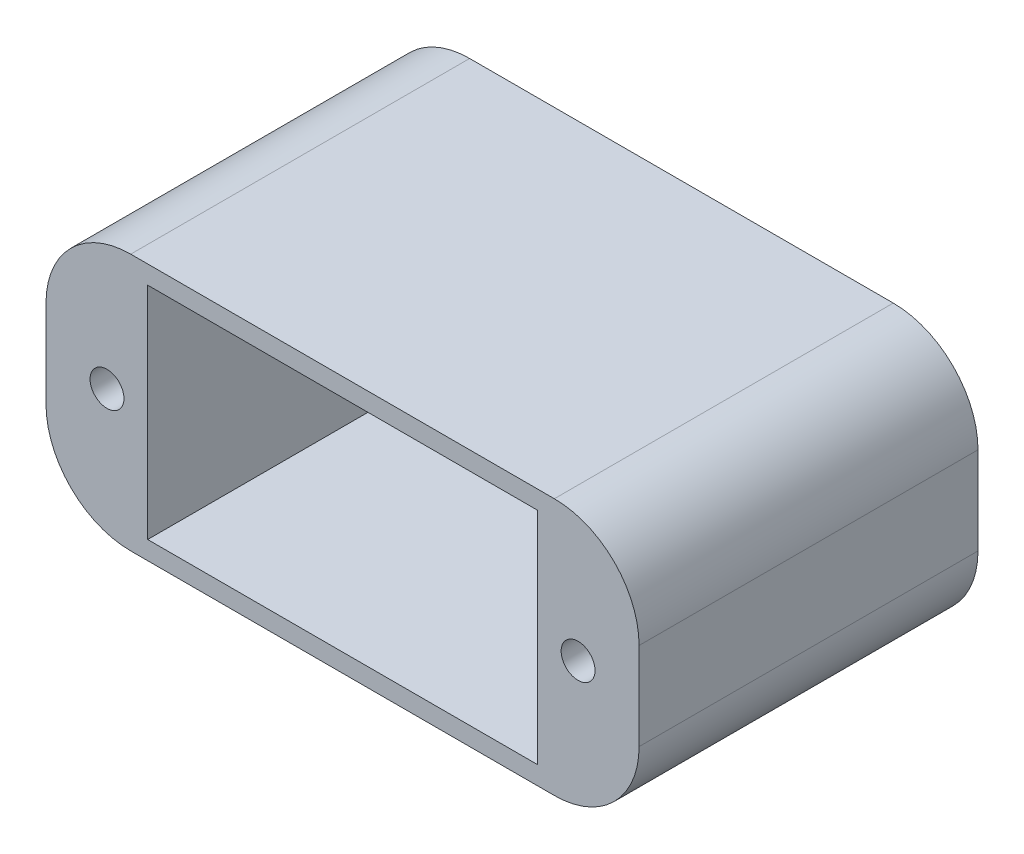
ISO-10303-21;
HEADER;
FILE_DESCRIPTION(('STEP AP214'),'2;1');
FILE_NAME('part.step','',(''),(''),'','','');
FILE_SCHEMA(('AUTOMOTIVE_DESIGN { 1 0 10303 214 1 1 1 1 }'));
ENDSEC;
DATA;
#1=APPLICATION_CONTEXT('core data for automotive mechanical design processes');
#2=APPLICATION_PROTOCOL_DEFINITION('international standard','automotive_design',2000,#1);
#3=PRODUCT_CONTEXT('',#1,'mechanical');
#4=PRODUCT('Part','Part','',(#3));
#5=PRODUCT_RELATED_PRODUCT_CATEGORY('part','',(#4));
#6=PRODUCT_DEFINITION_FORMATION('','',#4);
#7=PRODUCT_DEFINITION_CONTEXT('part definition',#1,'design');
#8=PRODUCT_DEFINITION('design','',#6,#7);
#9=PRODUCT_DEFINITION_SHAPE('','',#8);
#10=(LENGTH_UNIT() NAMED_UNIT(*) SI_UNIT(.MILLI.,.METRE.));
#11=(NAMED_UNIT(*) PLANE_ANGLE_UNIT() SI_UNIT($,.RADIAN.));
#12=(NAMED_UNIT(*) SI_UNIT($,.STERADIAN.) SOLID_ANGLE_UNIT());
#13=UNCERTAINTY_MEASURE_WITH_UNIT(LENGTH_MEASURE(1.E-05),#10,'distance_accuracy_value','');
#14=(GEOMETRIC_REPRESENTATION_CONTEXT(3) GLOBAL_UNCERTAINTY_ASSIGNED_CONTEXT((#13)) GLOBAL_UNIT_ASSIGNED_CONTEXT((#10,
#11,#12)) REPRESENTATION_CONTEXT('',''));
#15=CARTESIAN_POINT('',(0.,0.,0.));
#16=DIRECTION('',(0.,0.,1.));
#17=DIRECTION('',(1.,0.,0.));
#18=AXIS2_PLACEMENT_3D('',#15,#16,#17);
#19=CARTESIAN_POINT('',(17.5,-12.5,10.));
#20=DIRECTION('',(-1.,0.,0.));
#21=DIRECTION('',(0.,0.,1.));
#22=AXIS2_PLACEMENT_3D('',#19,#20,#21);
#23=PLANE('',#22);
#24=DIRECTION('',(0.,1.,0.));
#25=VECTOR('',#24,1.);
#26=CARTESIAN_POINT('',(17.5,-12.5,-10.));
#27=LINE('',#26,#25);
#28=CARTESIAN_POINT('',(17.5,-2.58431306893781,-10.));
#29=VERTEX_POINT('',#28);
#30=CARTESIAN_POINT('',(17.5,2.58431306893781,-10.));
#31=VERTEX_POINT('',#30);
#32=EDGE_CURVE('E165',#29,#31,#27,.T.);
#33=ORIENTED_EDGE('',*,*,#32,.T.);
#34=DIRECTION('',(0.,0.,1.));
#35=VECTOR('',#34,1.);
#36=CARTESIAN_POINT('',(17.5,2.58431306893781,10.));
#37=LINE('',#36,#35);
#38=CARTESIAN_POINT('',(17.5,2.58431306893781,10.));
#39=VERTEX_POINT('',#38);
#40=EDGE_CURVE('E188',#31,#39,#37,.T.);
#41=ORIENTED_EDGE('',*,*,#40,.T.);
#42=DIRECTION('',(0.,1.,0.));
#43=VECTOR('',#42,1.);
#44=CARTESIAN_POINT('',(17.5,-12.5,10.));
#45=LINE('',#44,#43);
#46=CARTESIAN_POINT('',(17.5,-2.58431306893781,10.));
#47=VERTEX_POINT('',#46);
#48=EDGE_CURVE('E169',#47,#39,#45,.T.);
#49=ORIENTED_EDGE('',*,*,#48,.F.);
#50=DIRECTION('',(0.,0.,1.));
#51=VECTOR('',#50,1.);
#52=CARTESIAN_POINT('',(17.5,-2.58431306893781,10.));
#53=LINE('',#52,#51);
#54=EDGE_CURVE('E184',#47,#29,#53,.F.);
#55=ORIENTED_EDGE('',*,*,#54,.T.);
#56=EDGE_LOOP('',(#33,#41,#49,#55));
#57=FACE_BOUND('',#56,.T.);
#58=ADVANCED_FACE('F33',(#57),#23,.F.);
#59=CARTESIAN_POINT('',(-17.5,-12.5,10.));
#60=DIRECTION('',(1.,0.,0.));
#61=DIRECTION('',(0.,0.,-1.));
#62=AXIS2_PLACEMENT_3D('',#59,#60,#61);
#63=PLANE('',#62);
#64=DIRECTION('',(0.,-1.,0.));
#65=VECTOR('',#64,1.);
#66=CARTESIAN_POINT('',(-17.5,-12.5,-10.));
#67=LINE('',#66,#65);
#68=CARTESIAN_POINT('',(-17.5,2.58431306893781,-10.));
#69=VERTEX_POINT('',#68);
#70=CARTESIAN_POINT('',(-17.5,-2.58431306893781,-10.));
#71=VERTEX_POINT('',#70);
#72=EDGE_CURVE('E173',#69,#71,#67,.T.);
#73=ORIENTED_EDGE('',*,*,#72,.T.);
#74=DIRECTION('',(0.,0.,1.));
#75=VECTOR('',#74,1.);
#76=CARTESIAN_POINT('',(-17.5,-2.58431306893781,10.));
#77=LINE('',#76,#75);
#78=CARTESIAN_POINT('',(-17.5,-2.58431306893781,10.));
#79=VERTEX_POINT('',#78);
#80=EDGE_CURVE('E208',#71,#79,#77,.T.);
#81=ORIENTED_EDGE('',*,*,#80,.T.);
#82=DIRECTION('',(0.,-1.,0.));
#83=VECTOR('',#82,1.);
#84=CARTESIAN_POINT('',(-17.5,-12.5,10.));
#85=LINE('',#84,#83);
#86=CARTESIAN_POINT('',(-17.5,2.58431306893781,10.));
#87=VERTEX_POINT('',#86);
#88=EDGE_CURVE('E172',#87,#79,#85,.T.);
#89=ORIENTED_EDGE('',*,*,#88,.F.);
#90=DIRECTION('',(0.,0.,1.));
#91=VECTOR('',#90,1.);
#92=CARTESIAN_POINT('',(-17.5,2.58431306893781,10.));
#93=LINE('',#92,#91);
#94=EDGE_CURVE('E204',#87,#69,#93,.F.);
#95=ORIENTED_EDGE('',*,*,#94,.T.);
#96=EDGE_LOOP('',(#73,#81,#89,#95));
#97=FACE_BOUND('',#96,.T.);
#98=ADVANCED_FACE('F214',(#97),#63,.F.);
#99=CARTESIAN_POINT('',(0.,0.,10.));
#100=DIRECTION('',(0.,0.,-1.));
#101=DIRECTION('',(-1.,0.,0.));
#102=AXIS2_PLACEMENT_3D('',#99,#100,#101);
#103=PLANE('',#102);
#104=CARTESIAN_POINT('',(-13.9,0.,10.));
#105=DIRECTION('',(0.,0.,1.));
#106=DIRECTION('',(1.,0.,0.));
#107=AXIS2_PLACEMENT_3D('',#104,#105,#106);
#108=CIRCLE('',#107,1.);
#109=CARTESIAN_POINT('',(-12.9,0.,10.));
#110=VERTEX_POINT('',#109);
#111=EDGE_CURVE('E236',#110,#110,#108,.T.);
#112=ORIENTED_EDGE('',*,*,#111,.F.);
#113=EDGE_LOOP('',(#112));
#114=FACE_BOUND('',#113,.T.);
#115=CARTESIAN_POINT('',(13.9,0.,10.));
#116=DIRECTION('',(0.,0.,1.));
#117=DIRECTION('',(-1.,0.,0.));
#118=AXIS2_PLACEMENT_3D('',#115,#116,#117);
#119=CIRCLE('',#118,1.);
#120=CARTESIAN_POINT('',(12.9,0.,10.));
#121=VERTEX_POINT('',#120);
#122=EDGE_CURVE('E243',#121,#121,#119,.T.);
#123=ORIENTED_EDGE('',*,*,#122,.F.);
#124=EDGE_LOOP('',(#123));
#125=FACE_BOUND('',#124,.T.);
#126=DIRECTION('',(-1.,0.,0.));
#127=VECTOR('',#126,1.);
#128=CARTESIAN_POINT('',(-11.5,6.50000000000001,10.));
#129=LINE('',#128,#127);
#130=CARTESIAN_POINT('',(11.5,6.50000000000001,10.));
#131=VERTEX_POINT('',#130);
#132=CARTESIAN_POINT('',(-11.5,6.50000000000001,10.));
#133=VERTEX_POINT('',#132);
#134=EDGE_CURVE('E158',#131,#133,#129,.T.);
#135=ORIENTED_EDGE('',*,*,#134,.F.);
#136=DIRECTION('',(0.,1.,0.));
#137=VECTOR('',#136,1.);
#138=CARTESIAN_POINT('',(11.5,-6.49999999999999,10.));
#139=LINE('',#138,#137);
#140=CARTESIAN_POINT('',(11.5,-6.49999999999999,10.));
#141=VERTEX_POINT('',#140);
#142=EDGE_CURVE('E129',#141,#131,#139,.T.);
#143=ORIENTED_EDGE('',*,*,#142,.F.);
#144=DIRECTION('',(1.,0.,0.));
#145=VECTOR('',#144,1.);
#146=CARTESIAN_POINT('',(-11.5,-6.49999999999999,10.));
#147=LINE('',#146,#145);
#148=CARTESIAN_POINT('',(-11.5,-6.49999999999999,10.));
#149=VERTEX_POINT('',#148);
#150=EDGE_CURVE('E146',#149,#141,#147,.T.);
#151=ORIENTED_EDGE('',*,*,#150,.F.);
#152=DIRECTION('',(0.,-1.,0.));
#153=VECTOR('',#152,1.);
#154=CARTESIAN_POINT('',(-11.5,-6.49999999999999,10.));
#155=LINE('',#154,#153);
#156=EDGE_CURVE('E149',#133,#149,#155,.T.);
#157=ORIENTED_EDGE('',*,*,#156,.F.);
#158=EDGE_LOOP('',(#135,#143,#151,#157));
#159=FACE_BOUND('',#158,.T.);
#160=ORIENTED_EDGE('',*,*,#88,.T.);
#161=CARTESIAN_POINT('',(-12.5,-2.58431306893781,10.));
#162=DIRECTION('',(0.,0.,-1.));
#163=DIRECTION('',(-1.,0.,0.));
#164=AXIS2_PLACEMENT_3D('',#161,#162,#163);
#165=CIRCLE('',#164,5.);
#166=CARTESIAN_POINT('',(-12.5,-7.58431306893781,10.));
#167=VERTEX_POINT('',#166);
#168=EDGE_CURVE('E55',#79,#167,#165,.F.);
#169=ORIENTED_EDGE('',*,*,#168,.T.);
#170=DIRECTION('',(-1.,0.,0.));
#171=VECTOR('',#170,1.);
#172=CARTESIAN_POINT('',(-17.5,-7.58431306893781,10.));
#173=LINE('',#172,#171);
#174=CARTESIAN_POINT('',(12.5,-7.58431306893781,10.));
#175=VERTEX_POINT('',#174);
#176=EDGE_CURVE('E152',#175,#167,#173,.T.);
#177=ORIENTED_EDGE('',*,*,#176,.F.);
#178=CARTESIAN_POINT('',(12.5,-2.58431306893781,10.));
#179=DIRECTION('',(0.,0.,-1.));
#180=DIRECTION('',(-1.,0.,0.));
#181=AXIS2_PLACEMENT_3D('',#178,#179,#180);
#182=CIRCLE('',#181,5.);
#183=EDGE_CURVE('E182',#175,#47,#182,.F.);
#184=ORIENTED_EDGE('',*,*,#183,.T.);
#185=ORIENTED_EDGE('',*,*,#48,.T.);
#186=CARTESIAN_POINT('',(12.5,2.58431306893781,10.));
#187=DIRECTION('',(0.,0.,-1.));
#188=DIRECTION('',(-1.,0.,0.));
#189=AXIS2_PLACEMENT_3D('',#186,#187,#188);
#190=CIRCLE('',#189,5.);
#191=CARTESIAN_POINT('',(12.5,7.58431306893781,10.));
#192=VERTEX_POINT('',#191);
#193=EDGE_CURVE('E191',#39,#192,#190,.F.);
#194=ORIENTED_EDGE('',*,*,#193,.T.);
#195=DIRECTION('',(1.,0.,0.));
#196=VECTOR('',#195,1.);
#197=CARTESIAN_POINT('',(-17.5,7.58431306893781,10.));
#198=LINE('',#197,#196);
#199=CARTESIAN_POINT('',(-12.5,7.58431306893781,10.));
#200=VERTEX_POINT('',#199);
#201=EDGE_CURVE('E221',#200,#192,#198,.T.);
#202=ORIENTED_EDGE('',*,*,#201,.F.);
#203=CARTESIAN_POINT('',(-12.5,2.58431306893781,10.));
#204=DIRECTION('',(0.,0.,-1.));
#205=DIRECTION('',(-1.,0.,0.));
#206=AXIS2_PLACEMENT_3D('',#203,#204,#205);
#207=CIRCLE('',#206,5.);
#208=EDGE_CURVE('E202',#200,#87,#207,.F.);
#209=ORIENTED_EDGE('',*,*,#208,.T.);
#210=EDGE_LOOP('',(#160,#169,#177,#184,#185,#194,#202,#209));
#211=FACE_BOUND('',#210,.T.);
#212=ADVANCED_FACE('F219',(#114,#125,#159,#211),#103,.F.);
#213=CARTESIAN_POINT('',(0.,0.,-10.));
#214=DIRECTION('',(0.,0.,-1.));
#215=DIRECTION('',(-1.,0.,0.));
#216=AXIS2_PLACEMENT_3D('',#213,#214,#215);
#217=PLANE('',#216);
#218=CARTESIAN_POINT('',(-13.9,0.,-10.));
#219=DIRECTION('',(0.,0.,-1.));
#220=DIRECTION('',(-1.,0.,0.));
#221=AXIS2_PLACEMENT_3D('',#218,#219,#220);
#222=CIRCLE('',#221,1.);
#223=CARTESIAN_POINT('',(-14.9,0.,-10.));
#224=VERTEX_POINT('',#223);
#225=EDGE_CURVE('E238',#224,#224,#222,.F.);
#226=ORIENTED_EDGE('',*,*,#225,.T.);
#227=EDGE_LOOP('',(#226));
#228=FACE_BOUND('',#227,.T.);
#229=CARTESIAN_POINT('',(13.9,0.,-10.));
#230=DIRECTION('',(0.,0.,-1.));
#231=DIRECTION('',(-1.,0.,0.));
#232=AXIS2_PLACEMENT_3D('',#229,#230,#231);
#233=CIRCLE('',#232,1.);
#234=CARTESIAN_POINT('',(12.9,0.,-10.));
#235=VERTEX_POINT('',#234);
#236=EDGE_CURVE('E247',#235,#235,#233,.F.);
#237=ORIENTED_EDGE('',*,*,#236,.T.);
#238=EDGE_LOOP('',(#237));
#239=FACE_BOUND('',#238,.T.);
#240=DIRECTION('',(-1.,0.,0.));
#241=VECTOR('',#240,1.);
#242=CARTESIAN_POINT('',(-17.5,-7.58431306893781,-10.));
#243=LINE('',#242,#241);
#244=CARTESIAN_POINT('',(12.5,-7.58431306893781,-10.));
#245=VERTEX_POINT('',#244);
#246=CARTESIAN_POINT('',(-12.5,-7.58431306893781,-10.));
#247=VERTEX_POINT('',#246);
#248=EDGE_CURVE('E235',#245,#247,#243,.T.);
#249=ORIENTED_EDGE('',*,*,#248,.T.);
#250=CARTESIAN_POINT('',(-12.5,-2.58431306893781,-10.));
#251=DIRECTION('',(0.,0.,-1.));
#252=DIRECTION('',(-1.,0.,0.));
#253=AXIS2_PLACEMENT_3D('',#250,#251,#252);
#254=CIRCLE('',#253,5.);
#255=EDGE_CURVE('E11',#247,#71,#254,.T.);
#256=ORIENTED_EDGE('',*,*,#255,.T.);
#257=ORIENTED_EDGE('',*,*,#72,.F.);
#258=CARTESIAN_POINT('',(-12.5,2.58431306893781,-10.));
#259=DIRECTION('',(0.,0.,-1.));
#260=DIRECTION('',(-1.,0.,0.));
#261=AXIS2_PLACEMENT_3D('',#258,#259,#260);
#262=CIRCLE('',#261,5.);
#263=CARTESIAN_POINT('',(-12.5,7.58431306893781,-10.));
#264=VERTEX_POINT('',#263);
#265=EDGE_CURVE('E206',#69,#264,#262,.T.);
#266=ORIENTED_EDGE('',*,*,#265,.T.);
#267=DIRECTION('',(1.,0.,0.));
#268=VECTOR('',#267,1.);
#269=CARTESIAN_POINT('',(-17.5,7.58431306893781,-10.));
#270=LINE('',#269,#268);
#271=CARTESIAN_POINT('',(12.5,7.58431306893781,-10.));
#272=VERTEX_POINT('',#271);
#273=EDGE_CURVE('E159',#264,#272,#270,.T.);
#274=ORIENTED_EDGE('',*,*,#273,.T.);
#275=CARTESIAN_POINT('',(12.5,2.58431306893781,-10.));
#276=DIRECTION('',(0.,0.,-1.));
#277=DIRECTION('',(-1.,0.,0.));
#278=AXIS2_PLACEMENT_3D('',#275,#276,#277);
#279=CIRCLE('',#278,5.);
#280=EDGE_CURVE('E197',#272,#31,#279,.T.);
#281=ORIENTED_EDGE('',*,*,#280,.T.);
#282=ORIENTED_EDGE('',*,*,#32,.F.);
#283=CARTESIAN_POINT('',(12.5,-2.58431306893781,-10.));
#284=DIRECTION('',(0.,0.,-1.));
#285=DIRECTION('',(-1.,0.,0.));
#286=AXIS2_PLACEMENT_3D('',#283,#284,#285);
#287=CIRCLE('',#286,5.);
#288=EDGE_CURVE('E186',#29,#245,#287,.T.);
#289=ORIENTED_EDGE('',*,*,#288,.T.);
#290=EDGE_LOOP('',(#249,#256,#257,#266,#274,#281,#282,#289));
#291=FACE_BOUND('',#290,.T.);
#292=ADVANCED_FACE('F251',(#228,#239,#291),#217,.T.);
#293=CARTESIAN_POINT('',(11.5,-6.49999999999999,-6.));
#294=DIRECTION('',(1.,0.,0.));
#295=DIRECTION('',(0.,0.,-1.));
#296=AXIS2_PLACEMENT_3D('',#293,#294,#295);
#297=PLANE('',#296);
#298=ORIENTED_EDGE('',*,*,#142,.T.);
#299=DIRECTION('',(0.,0.,1.));
#300=VECTOR('',#299,1.);
#301=CARTESIAN_POINT('',(11.5,6.50000000000001,-6.));
#302=LINE('',#301,#300);
#303=CARTESIAN_POINT('',(11.5,6.50000000000001,-6.));
#304=VERTEX_POINT('',#303);
#305=EDGE_CURVE('E122',#304,#131,#302,.T.);
#306=ORIENTED_EDGE('',*,*,#305,.F.);
#307=DIRECTION('',(0.,1.,0.));
#308=VECTOR('',#307,1.);
#309=CARTESIAN_POINT('',(11.5,-6.49999999999999,-6.));
#310=LINE('',#309,#308);
#311=CARTESIAN_POINT('',(11.5,-6.49999999999999,-6.));
#312=VERTEX_POINT('',#311);
#313=EDGE_CURVE('E126',#312,#304,#310,.T.);
#314=ORIENTED_EDGE('',*,*,#313,.F.);
#315=DIRECTION('',(0.,0.,1.));
#316=VECTOR('',#315,1.);
#317=CARTESIAN_POINT('',(11.5,-6.49999999999999,-6.));
#318=LINE('',#317,#316);
#319=EDGE_CURVE('E163',#312,#141,#318,.T.);
#320=ORIENTED_EDGE('',*,*,#319,.T.);
#321=EDGE_LOOP('',(#298,#306,#314,#320));
#322=FACE_BOUND('',#321,.T.);
#323=ADVANCED_FACE('F124',(#322),#297,.F.);
#324=CARTESIAN_POINT('',(-11.5,-6.49999999999999,-6.));
#325=DIRECTION('',(0.,-1.,0.));
#326=DIRECTION('',(0.,0.,-1.));
#327=AXIS2_PLACEMENT_3D('',#324,#325,#326);
#328=PLANE('',#327);
#329=ORIENTED_EDGE('',*,*,#150,.T.);
#330=ORIENTED_EDGE('',*,*,#319,.F.);
#331=DIRECTION('',(1.,0.,0.));
#332=VECTOR('',#331,1.);
#333=CARTESIAN_POINT('',(-11.5,-6.49999999999999,-6.));
#334=LINE('',#333,#332);
#335=CARTESIAN_POINT('',(-11.5,-6.49999999999999,-6.));
#336=VERTEX_POINT('',#335);
#337=EDGE_CURVE('E134',#336,#312,#334,.T.);
#338=ORIENTED_EDGE('',*,*,#337,.F.);
#339=DIRECTION('',(0.,0.,1.));
#340=VECTOR('',#339,1.);
#341=CARTESIAN_POINT('',(-11.5,-6.49999999999999,-6.));
#342=LINE('',#341,#340);
#343=EDGE_CURVE('E166',#336,#149,#342,.T.);
#344=ORIENTED_EDGE('',*,*,#343,.T.);
#345=EDGE_LOOP('',(#329,#330,#338,#344));
#346=FACE_BOUND('',#345,.T.);
#347=ADVANCED_FACE('F269',(#346),#328,.F.);
#348=CARTESIAN_POINT('',(-11.5,-6.49999999999999,-6.));
#349=DIRECTION('',(-1.,0.,0.));
#350=DIRECTION('',(0.,0.,1.));
#351=AXIS2_PLACEMENT_3D('',#348,#349,#350);
#352=PLANE('',#351);
#353=ORIENTED_EDGE('',*,*,#156,.T.);
#354=ORIENTED_EDGE('',*,*,#343,.F.);
#355=DIRECTION('',(0.,-1.,0.));
#356=VECTOR('',#355,1.);
#357=CARTESIAN_POINT('',(-11.5,-6.49999999999999,-6.));
#358=LINE('',#357,#356);
#359=CARTESIAN_POINT('',(-11.5,6.50000000000001,-6.));
#360=VERTEX_POINT('',#359);
#361=EDGE_CURVE('E142',#360,#336,#358,.T.);
#362=ORIENTED_EDGE('',*,*,#361,.F.);
#363=DIRECTION('',(0.,0.,1.));
#364=VECTOR('',#363,1.);
#365=CARTESIAN_POINT('',(-11.5,6.50000000000001,-6.));
#366=LINE('',#365,#364);
#367=EDGE_CURVE('E133',#360,#133,#366,.T.);
#368=ORIENTED_EDGE('',*,*,#367,.T.);
#369=EDGE_LOOP('',(#353,#354,#362,#368));
#370=FACE_BOUND('',#369,.T.);
#371=ADVANCED_FACE('F267',(#370),#352,.F.);
#372=CARTESIAN_POINT('',(-11.5,6.50000000000001,-6.));
#373=DIRECTION('',(0.,1.,0.));
#374=DIRECTION('',(0.,0.,1.));
#375=AXIS2_PLACEMENT_3D('',#372,#373,#374);
#376=PLANE('',#375);
#377=ORIENTED_EDGE('',*,*,#134,.T.);
#378=ORIENTED_EDGE('',*,*,#367,.F.);
#379=DIRECTION('',(-1.,0.,0.));
#380=VECTOR('',#379,1.);
#381=CARTESIAN_POINT('',(-11.5,6.50000000000001,-6.));
#382=LINE('',#381,#380);
#383=EDGE_CURVE('E137',#304,#360,#382,.T.);
#384=ORIENTED_EDGE('',*,*,#383,.F.);
#385=ORIENTED_EDGE('',*,*,#305,.T.);
#386=EDGE_LOOP('',(#377,#378,#384,#385));
#387=FACE_BOUND('',#386,.T.);
#388=ADVANCED_FACE('F138',(#387),#376,.F.);
#389=CARTESIAN_POINT('',(0.,0.,-6.));
#390=DIRECTION('',(0.,0.,-1.));
#391=DIRECTION('',(-1.,0.,0.));
#392=AXIS2_PLACEMENT_3D('',#389,#390,#391);
#393=PLANE('',#392);
#394=ORIENTED_EDGE('',*,*,#313,.T.);
#395=ORIENTED_EDGE('',*,*,#383,.T.);
#396=ORIENTED_EDGE('',*,*,#361,.T.);
#397=ORIENTED_EDGE('',*,*,#337,.T.);
#398=EDGE_LOOP('',(#394,#395,#396,#397));
#399=FACE_BOUND('',#398,.T.);
#400=ADVANCED_FACE('F144',(#399),#393,.F.);
#401=CARTESIAN_POINT('',(-17.5,-7.58431306893781,-10.001));
#402=DIRECTION('',(0.,1.,0.));
#403=DIRECTION('',(0.,0.,1.));
#404=AXIS2_PLACEMENT_3D('',#401,#402,#403);
#405=PLANE('',#404);
#406=ORIENTED_EDGE('',*,*,#176,.T.);
#407=DIRECTION('',(0.,0.,1.));
#408=VECTOR('',#407,1.);
#409=CARTESIAN_POINT('',(-12.5,-7.58431306893781,-10.001));
#410=LINE('',#409,#408);
#411=EDGE_CURVE('E41',#167,#247,#410,.F.);
#412=ORIENTED_EDGE('',*,*,#411,.T.);
#413=ORIENTED_EDGE('',*,*,#248,.F.);
#414=DIRECTION('',(0.,0.,1.));
#415=VECTOR('',#414,1.);
#416=CARTESIAN_POINT('',(12.5,-7.58431306893781,-10.001));
#417=LINE('',#416,#415);
#418=EDGE_CURVE('E175',#245,#175,#417,.T.);
#419=ORIENTED_EDGE('',*,*,#418,.T.);
#420=EDGE_LOOP('',(#406,#412,#413,#419));
#421=FACE_BOUND('',#420,.T.);
#422=ADVANCED_FACE('F311',(#421),#405,.F.);
#423=CARTESIAN_POINT('',(-17.5,7.58431306893781,-10.001));
#424=DIRECTION('',(0.,-1.,0.));
#425=DIRECTION('',(0.,0.,-1.));
#426=AXIS2_PLACEMENT_3D('',#423,#424,#425);
#427=PLANE('',#426);
#428=ORIENTED_EDGE('',*,*,#273,.F.);
#429=DIRECTION('',(0.,0.,1.));
#430=VECTOR('',#429,1.);
#431=CARTESIAN_POINT('',(-12.5,7.58431306893781,-10.001));
#432=LINE('',#431,#430);
#433=EDGE_CURVE('E199',#264,#200,#432,.T.);
#434=ORIENTED_EDGE('',*,*,#433,.T.);
#435=ORIENTED_EDGE('',*,*,#201,.T.);
#436=DIRECTION('',(0.,0.,1.));
#437=VECTOR('',#436,1.);
#438=CARTESIAN_POINT('',(12.5,7.58431306893781,-10.001));
#439=LINE('',#438,#437);
#440=EDGE_CURVE('E194',#192,#272,#439,.F.);
#441=ORIENTED_EDGE('',*,*,#440,.T.);
#442=EDGE_LOOP('',(#428,#434,#435,#441));
#443=FACE_BOUND('',#442,.T.);
#444=ADVANCED_FACE('F228',(#443),#427,.F.);
#445=CARTESIAN_POINT('',(12.5,-2.58431306893781,-10.001));
#446=DIRECTION('',(0.,0.,1.));
#447=DIRECTION('',(1.,0.,0.));
#448=AXIS2_PLACEMENT_3D('',#445,#446,#447);
#449=CYLINDRICAL_SURFACE('',#448,5.);
#450=ORIENTED_EDGE('',*,*,#288,.F.);
#451=ORIENTED_EDGE('',*,*,#54,.F.);
#452=ORIENTED_EDGE('',*,*,#183,.F.);
#453=ORIENTED_EDGE('',*,*,#418,.F.);
#454=EDGE_LOOP('',(#450,#451,#452,#453));
#455=FACE_BOUND('',#454,.T.);
#456=ADVANCED_FACE('F288',(#455),#449,.T.);
#457=CARTESIAN_POINT('',(12.5,2.58431306893781,10.));
#458=DIRECTION('',(0.,0.,1.));
#459=DIRECTION('',(1.,0.,0.));
#460=AXIS2_PLACEMENT_3D('',#457,#458,#459);
#461=CYLINDRICAL_SURFACE('',#460,5.);
#462=ORIENTED_EDGE('',*,*,#280,.F.);
#463=ORIENTED_EDGE('',*,*,#440,.F.);
#464=ORIENTED_EDGE('',*,*,#193,.F.);
#465=ORIENTED_EDGE('',*,*,#40,.F.);
#466=EDGE_LOOP('',(#462,#463,#464,#465));
#467=FACE_BOUND('',#466,.T.);
#468=ADVANCED_FACE('F291',(#467),#461,.T.);
#469=CARTESIAN_POINT('',(-12.5,2.58431306893781,-10.001));
#470=DIRECTION('',(0.,0.,1.));
#471=DIRECTION('',(1.,0.,0.));
#472=AXIS2_PLACEMENT_3D('',#469,#470,#471);
#473=CYLINDRICAL_SURFACE('',#472,5.);
#474=ORIENTED_EDGE('',*,*,#265,.F.);
#475=ORIENTED_EDGE('',*,*,#94,.F.);
#476=ORIENTED_EDGE('',*,*,#208,.F.);
#477=ORIENTED_EDGE('',*,*,#433,.F.);
#478=EDGE_LOOP('',(#474,#475,#476,#477));
#479=FACE_BOUND('',#478,.T.);
#480=ADVANCED_FACE('F225',(#479),#473,.T.);
#481=CARTESIAN_POINT('',(-12.5,-2.58431306893781,10.));
#482=DIRECTION('',(0.,0.,1.));
#483=DIRECTION('',(1.,0.,0.));
#484=AXIS2_PLACEMENT_3D('',#481,#482,#483);
#485=CYLINDRICAL_SURFACE('',#484,5.);
#486=ORIENTED_EDGE('',*,*,#255,.F.);
#487=ORIENTED_EDGE('',*,*,#411,.F.);
#488=ORIENTED_EDGE('',*,*,#168,.F.);
#489=ORIENTED_EDGE('',*,*,#80,.F.);
#490=EDGE_LOOP('',(#486,#487,#488,#489));
#491=FACE_BOUND('',#490,.T.);
#492=ADVANCED_FACE('F35',(#491),#485,.T.);
#493=CARTESIAN_POINT('',(13.9,0.,-10.001));
#494=DIRECTION('',(0.,0.,1.));
#495=DIRECTION('',(1.,0.,0.));
#496=AXIS2_PLACEMENT_3D('',#493,#494,#495);
#497=CYLINDRICAL_SURFACE('',#496,1.);
#498=ORIENTED_EDGE('',*,*,#236,.F.);
#499=EDGE_LOOP('',(#498));
#500=FACE_BOUND('',#499,.T.);
#501=ORIENTED_EDGE('',*,*,#122,.T.);
#502=EDGE_LOOP('',(#501));
#503=FACE_BOUND('',#502,.T.);
#504=ADVANCED_FACE('F253',(#500,#503),#497,.F.);
#505=CARTESIAN_POINT('',(-13.9,0.,-10.001));
#506=DIRECTION('',(0.,0.,1.));
#507=DIRECTION('',(1.,0.,0.));
#508=AXIS2_PLACEMENT_3D('',#505,#506,#507);
#509=CYLINDRICAL_SURFACE('',#508,1.);
#510=ORIENTED_EDGE('',*,*,#225,.F.);
#511=EDGE_LOOP('',(#510));
#512=FACE_BOUND('',#511,.T.);
#513=ORIENTED_EDGE('',*,*,#111,.T.);
#514=EDGE_LOOP('',(#513));
#515=FACE_BOUND('',#514,.T.);
#516=ADVANCED_FACE('F256',(#512,#515),#509,.F.);
#517=CLOSED_SHELL('',(#58,#98,#212,#292,#323,#347,#371,#388,#400,#422,#444,#456,#468,#480,#492,
#504,#516));
#518=MANIFOLD_SOLID_BREP('B2',#517);
#519=ADVANCED_BREP_SHAPE_REPRESENTATION('',(#18,#518),#14);
#520=SHAPE_DEFINITION_REPRESENTATION(#9,#519);
ENDSEC;
END-ISO-10303-21;
